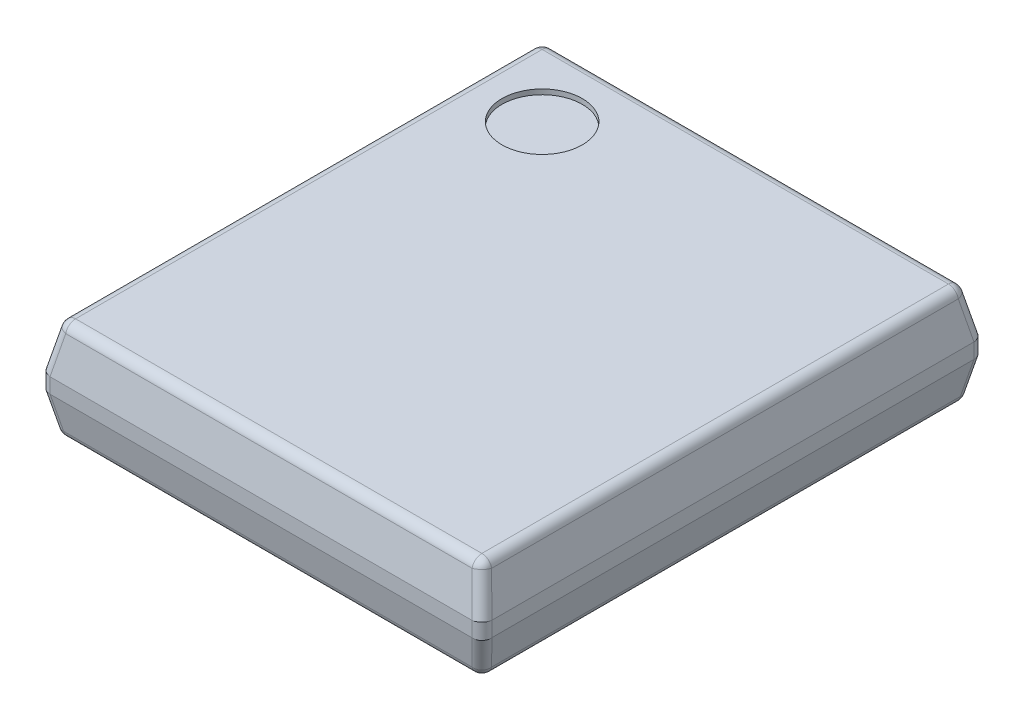
ISO-10303-21;
HEADER;
FILE_DESCRIPTION(('STEP AP214'),'2;1');
FILE_NAME('part.step','',(''),(''),'','','');
FILE_SCHEMA(('AUTOMOTIVE_DESIGN { 1 0 10303 214 1 1 1 1 }'));
ENDSEC;
DATA;
#1=APPLICATION_CONTEXT('core data for automotive mechanical design processes');
#2=APPLICATION_PROTOCOL_DEFINITION('international standard','automotive_design',2000,#1);
#3=PRODUCT_CONTEXT('',#1,'mechanical');
#4=PRODUCT('Part','Part','',(#3));
#5=PRODUCT_RELATED_PRODUCT_CATEGORY('part','',(#4));
#6=PRODUCT_DEFINITION_FORMATION('','',#4);
#7=PRODUCT_DEFINITION_CONTEXT('part definition',#1,'design');
#8=PRODUCT_DEFINITION('design','',#6,#7);
#9=PRODUCT_DEFINITION_SHAPE('','',#8);
#10=(LENGTH_UNIT() NAMED_UNIT(*) SI_UNIT(.MILLI.,.METRE.));
#11=(NAMED_UNIT(*) PLANE_ANGLE_UNIT() SI_UNIT($,.RADIAN.));
#12=(NAMED_UNIT(*) SI_UNIT($,.STERADIAN.) SOLID_ANGLE_UNIT());
#13=UNCERTAINTY_MEASURE_WITH_UNIT(LENGTH_MEASURE(1.E-05),#10,'distance_accuracy_value','');
#14=(GEOMETRIC_REPRESENTATION_CONTEXT(3) GLOBAL_UNCERTAINTY_ASSIGNED_CONTEXT((#13)) GLOBAL_UNIT_ASSIGNED_CONTEXT((#10,
#11,#12)) REPRESENTATION_CONTEXT('',''));
#15=CARTESIAN_POINT('',(0.,0.,0.));
#16=DIRECTION('',(0.,0.,1.));
#17=DIRECTION('',(1.,0.,0.));
#18=AXIS2_PLACEMENT_3D('',#15,#16,#17);
#19=CARTESIAN_POINT('',(8.213637663993,1.93,-0.471641184493));
#20=DIRECTION('',(0.,0.629320391049922,-0.777145961456903));
#21=DIRECTION('',(0.,-0.777145961456903,-0.629320391049922));
#22=AXIS2_PLACEMENT_3D('',#19,#20,#21);
#23=SPHERICAL_SURFACE('',#22,0.1);
#24=CARTESIAN_POINT('',(8.213637663993,1.93,-0.471641184493));
#25=DIRECTION('',(-1.,0.,0.));
#26=DIRECTION('',(0.,-0.20791169081795,-0.978147600733765));
#27=AXIS2_PLACEMENT_3D('',#24,#25,#26);
#28=CIRCLE('',#27,0.1);
#29=CARTESIAN_POINT('',(8.213637663993,1.909208830918,-0.569455944567));
#30=VERTEX_POINT('',#29);
#31=CARTESIAN_POINT('',(8.213637663993,1.83,-0.471641184493));
#32=VERTEX_POINT('',#31);
#33=EDGE_CURVE('E11',#30,#32,#28,.T.);
#34=ORIENTED_EDGE('',*,*,#33,.T.);
#35=CARTESIAN_POINT('',(8.213637663993,1.93,-0.471641184493));
#36=DIRECTION('',(0.,0.,-1.));
#37=DIRECTION('',(0.,-1.,0.));
#38=AXIS2_PLACEMENT_3D('',#35,#36,#37);
#39=CIRCLE('',#38,0.1);
#40=CARTESIAN_POINT('',(8.115822903919,1.909208830918,-0.471641184493));
#41=VERTEX_POINT('',#40);
#42=EDGE_CURVE('E492',#32,#41,#39,.T.);
#43=ORIENTED_EDGE('',*,*,#42,.T.);
#44=CARTESIAN_POINT('',(8.213637663993,1.93,-0.471641184493));
#45=DIRECTION('',(0.203558594952956,-0.957667894857893,0.203558594952977));
#46=DIRECTION('',(-0.978147600733765,-0.20791169081795,0.));
#47=AXIS2_PLACEMENT_3D('',#44,#45,#46);
#48=CIRCLE('',#47,0.1);
#49=EDGE_CURVE('E288',#41,#30,#48,.T.);
#50=ORIENTED_EDGE('',*,*,#49,.T.);
#51=EDGE_LOOP('',(#34,#43,#50));
#52=FACE_BOUND('',#51,.T.);
#53=ADVANCED_FACE('F17',(#52),#23,.T.);
#54=CARTESIAN_POINT('',(2.311796636005,1.93,-0.471641184493));
#55=DIRECTION('',(1.,0.,0.));
#56=DIRECTION('',(0.,-1.,0.));
#57=AXIS2_PLACEMENT_3D('',#54,#55,#56);
#58=CYLINDRICAL_SURFACE('',#57,0.1);
#59=DIRECTION('',(1.,0.,0.));
#60=VECTOR('',#59,1.);
#61=CARTESIAN_POINT('',(8.213637663993,1.909208830918,-0.569455944567));
#62=LINE('',#61,#60);
#63=CARTESIAN_POINT('',(12.281635608017,1.909208830918,-0.569455944567));
#64=VERTEX_POINT('',#63);
#65=EDGE_CURVE('E433',#30,#64,#62,.T.);
#66=ORIENTED_EDGE('',*,*,#65,.T.);
#67=CARTESIAN_POINT('',(12.281635608017,1.93,-0.471641184493));
#68=DIRECTION('',(1.,0.,0.));
#69=DIRECTION('',(0.,-1.,0.));
#70=AXIS2_PLACEMENT_3D('',#67,#68,#69);
#71=CIRCLE('',#70,0.1);
#72=CARTESIAN_POINT('',(12.281635608017,1.83,-0.471641184493));
#73=VERTEX_POINT('',#72);
#74=EDGE_CURVE('E27',#73,#64,#71,.T.);
#75=ORIENTED_EDGE('',*,*,#74,.F.);
#76=DIRECTION('',(1.,0.,0.));
#77=VECTOR('',#76,1.);
#78=CARTESIAN_POINT('',(8.213637663993,1.83,-0.471641184493));
#79=LINE('',#78,#77);
#80=EDGE_CURVE('E621',#32,#73,#79,.T.);
#81=ORIENTED_EDGE('',*,*,#80,.F.);
#82=ORIENTED_EDGE('',*,*,#33,.F.);
#83=EDGE_LOOP('',(#66,#75,#81,#82));
#84=FACE_BOUND('',#83,.T.);
#85=ADVANCED_FACE('F602',(#84),#58,.T.);
#86=CARTESIAN_POINT('',(12.281635608017,1.93,-0.471641184493));
#87=DIRECTION('',(-0.707106781186548,0.,-0.707106781186548));
#88=DIRECTION('',(0.677173462578709,-0.287875325719876,-0.677173462578709));
#89=AXIS2_PLACEMENT_3D('',#86,#87,#88);
#90=SPHERICAL_SURFACE('',#89,0.1);
#91=CARTESIAN_POINT('',(12.281635608017,1.93,-0.471641184493));
#92=DIRECTION('',(0.,0.,-1.));
#93=DIRECTION('',(0.978147600733765,-0.20791169081795,0.));
#94=AXIS2_PLACEMENT_3D('',#91,#92,#93);
#95=CIRCLE('',#94,0.1);
#96=CARTESIAN_POINT('',(12.379450368091,1.909208830918,-0.471641184493));
#97=VERTEX_POINT('',#96);
#98=EDGE_CURVE('E530',#97,#73,#95,.T.);
#99=ORIENTED_EDGE('',*,*,#98,.T.);
#100=ORIENTED_EDGE('',*,*,#74,.T.);
#101=CARTESIAN_POINT('',(12.281635608017,1.93,-0.471641184493));
#102=DIRECTION('',(-0.203558594952977,-0.957667894857893,0.203558594952956));
#103=DIRECTION('',(0.,-0.20791169081795,-0.978147600733765));
#104=AXIS2_PLACEMENT_3D('',#101,#102,#103);
#105=CIRCLE('',#104,0.1);
#106=EDGE_CURVE('E446',#64,#97,#105,.T.);
#107=ORIENTED_EDGE('',*,*,#106,.T.);
#108=EDGE_LOOP('',(#99,#100,#107));
#109=FACE_BOUND('',#108,.T.);
#110=ADVANCED_FACE('F608',(#109),#90,.T.);
#111=CARTESIAN_POINT('',(8.047636636005,2.23,4.362357787519));
#112=DIRECTION('',(0.,-0.20791169081795,0.978147600733765));
#113=DIRECTION('',(-1.,0.,0.));
#114=AXIS2_PLACEMENT_3D('',#111,#112,#113);
#115=PLANE('',#114);
#116=DIRECTION('',(-0.203558594952977,-0.957667894857889,-0.203558594952977));
#117=VECTOR('',#116,1.);
#118=CARTESIAN_POINT('',(12.349798504817,2.229890047549,4.362334416404));
#119=LINE('',#118,#117);
#120=CARTESIAN_POINT('',(12.3487007762339,2.22986601338305,4.36232930778436));
#121=VERTEX_POINT('',#120);
#122=CARTESIAN_POINT('',(12.281635608017,1.909208830918,4.294171519605));
#123=VERTEX_POINT('',#122);
#124=EDGE_CURVE('E251',#121,#123,#119,.T.);
#125=ORIENTED_EDGE('',*,*,#124,.F.);
#126=DIRECTION('',(1.,0.,0.));
#127=VECTOR('',#126,1.);
#128=CARTESIAN_POINT('',(8.147636636005,2.23,4.362357787519));
#129=LINE('',#128,#127);
#130=CARTESIAN_POINT('',(8.14658362211617,2.22981366806874,4.36231818144432));
#131=VERTEX_POINT('',#130);
#132=EDGE_CURVE('E264',#131,#121,#129,.T.);
#133=ORIENTED_EDGE('',*,*,#132,.F.);
#134=DIRECTION('',(0.203558594952977,-0.957667894857889,-0.203558594952977));
#135=VECTOR('',#134,1.);
#136=CARTESIAN_POINT('',(8.145474767193,2.229890047549,4.362334416404));
#137=LINE('',#136,#135);
#138=CARTESIAN_POINT('',(8.213637663993,1.909208830918,4.294171519605));
#139=VERTEX_POINT('',#138);
#140=EDGE_CURVE('E474',#131,#139,#137,.T.);
#141=ORIENTED_EDGE('',*,*,#140,.T.);
#142=DIRECTION('',(-1.,0.,0.));
#143=VECTOR('',#142,1.);
#144=CARTESIAN_POINT('',(12.281635608017,1.909208830918,4.294171519605));
#145=LINE('',#144,#143);
#146=EDGE_CURVE('E525',#123,#139,#145,.T.);
#147=ORIENTED_EDGE('',*,*,#146,.F.);
#148=EDGE_LOOP('',(#125,#133,#141,#147));
#149=FACE_BOUND('',#148,.T.);
#150=ADVANCED_FACE('F1058',(#149),#115,.T.);
#151=CARTESIAN_POINT('',(12.750025247314,4.1336,4.664746398828));
#152=DIRECTION('',(-0.203558594952956,-0.957667894857893,-0.203558594952977));
#153=DIRECTION('',(0.978147600733765,-0.20791169081795,0.));
#154=AXIS2_PLACEMENT_3D('',#151,#152,#153);
#155=CYLINDRICAL_SURFACE('',#154,0.1);
#156=ORIENTED_EDGE('',*,*,#124,.T.);
#157=CARTESIAN_POINT('',(12.281635608017,1.93,4.196356759531));
#158=DIRECTION('',(-0.203558594952956,-0.957667894857893,-0.203558594952977));
#159=DIRECTION('',(0.978147600733765,-0.20791169081795,0.));
#160=AXIS2_PLACEMENT_3D('',#157,#158,#159);
#161=CIRCLE('',#160,0.1);
#162=CARTESIAN_POINT('',(12.379450368091,1.909208830918,4.196356759531));
#163=VERTEX_POINT('',#162);
#164=EDGE_CURVE('E521',#163,#123,#161,.T.);
#165=ORIENTED_EDGE('',*,*,#164,.F.);
#166=DIRECTION('',(-0.203558594952977,-0.957667894857889,-0.203558594952977));
#167=VECTOR('',#166,1.);
#168=CARTESIAN_POINT('',(12.44761326489,2.229890047549,4.264519656331));
#169=LINE('',#168,#167);
#170=CARTESIAN_POINT('',(12.4476011592059,2.22983309478305,4.26341493068342));
#171=VERTEX_POINT('',#170);
#172=EDGE_CURVE('E457',#171,#163,#169,.T.);
#173=ORIENTED_EDGE('',*,*,#172,.F.);
#174=CARTESIAN_POINT('',(12.34763206419,2.240511374283,4.262353215704));
#175=DIRECTION('',(-0.10287383673995,-0.989360372881795,-0.10287383673995));
#176=DIRECTION('',(-0.699583428701968,0.145485575130993,-0.699583428701968));
#177=AXIS2_PLACEMENT_3D('',#174,#175,#176);
#178=ELLIPSE('',#177,0.101081939669,0.10000271133);
#179=EDGE_CURVE('E256',#171,#121,#178,.T.);
#180=ORIENTED_EDGE('',*,*,#179,.T.);
#181=EDGE_LOOP('',(#156,#165,#173,#180));
#182=FACE_BOUND('',#181,.T.);
#183=ADVANCED_FACE('F1206',(#182),#155,.T.);
#184=CARTESIAN_POINT('',(11.972663389974,4.1336,3.887384541488));
#185=DIRECTION('',(0.203558594952956,-0.957667894857893,0.203558594952977));
#186=DIRECTION('',(0.978147600733765,0.20791169081795,0.));
#187=AXIS2_PLACEMENT_3D('',#184,#185,#186);
#188=CYLINDRICAL_SURFACE('',#187,0.1);
#189=DIRECTION('',(0.203558594952977,-0.957667894857889,0.203558594952977));
#190=VECTOR('',#189,1.);
#191=CARTESIAN_POINT('',(12.368822540007,2.750791169082,4.185728931448));
#192=LINE('',#191,#190);
#193=CARTESIAN_POINT('',(12.368822540007,2.750791169082,4.185728931448));
#194=VERTEX_POINT('',#193);
#195=CARTESIAN_POINT('',(12.4476081562703,2.38013398661692,4.26342192774778));
#196=VERTEX_POINT('',#195);
#197=EDGE_CURVE('E385',#194,#196,#192,.T.);
#198=ORIENTED_EDGE('',*,*,#197,.F.);
#199=CARTESIAN_POINT('',(12.271007779934,2.73,4.185728931448));
#200=DIRECTION('',(-0.203558594952977,0.957667894857893,-0.203558594952956));
#201=DIRECTION('',(0.,0.20791169081795,0.978147600733765));
#202=AXIS2_PLACEMENT_3D('',#199,#200,#201);
#203=CIRCLE('',#202,0.1);
#204=CARTESIAN_POINT('',(12.271007779934,2.750791169082,4.283543691521));
#205=VERTEX_POINT('',#204);
#206=EDGE_CURVE('E505',#205,#194,#203,.T.);
#207=ORIENTED_EDGE('',*,*,#206,.F.);
#208=DIRECTION('',(0.203558594952977,-0.957667894857889,0.203558594952977));
#209=VECTOR('',#208,1.);
#210=CARTESIAN_POINT('',(12.271007779934,2.750791169082,4.283543691521));
#211=LINE('',#210,#209);
#212=CARTESIAN_POINT('',(12.3487007762338,2.38013398661692,4.36232930778428));
#213=VERTEX_POINT('',#212);
#214=EDGE_CURVE('E361',#205,#213,#211,.T.);
#215=ORIENTED_EDGE('',*,*,#214,.T.);
#216=CARTESIAN_POINT('',(12.34763206419,2.369488625717,4.262353215704));
#217=DIRECTION('',(-0.10287383673995,0.989360372881795,-0.10287383673995));
#218=DIRECTION('',(0.699583428702968,0.145485575130993,0.699583428700969));
#219=AXIS2_PLACEMENT_3D('',#216,#217,#218);
#220=ELLIPSE('',#219,0.101081939669,0.10000271133);
#221=EDGE_CURVE('E261',#213,#196,#220,.T.);
#222=ORIENTED_EDGE('',*,*,#221,.T.);
#223=EDGE_LOOP('',(#198,#207,#215,#222));
#224=FACE_BOUND('',#223,.T.);
#225=ADVANCED_FACE('F1198',(#224),#188,.T.);
#226=CARTESIAN_POINT('',(8.224265492076,2.73,4.185728931448));
#227=DIRECTION('',(0.,-0.629320391049922,0.777145961456903));
#228=DIRECTION('',(0.,0.777145961456903,0.629320391049922));
#229=AXIS2_PLACEMENT_3D('',#226,#227,#228);
#230=SPHERICAL_SURFACE('',#229,0.1);
#231=CARTESIAN_POINT('',(8.224265492076,2.73,4.185728931448));
#232=DIRECTION('',(0.203558594952956,0.957667894857893,-0.203558594952977));
#233=DIRECTION('',(-0.978147600733765,0.20791169081795,0.));
#234=AXIS2_PLACEMENT_3D('',#231,#232,#233);
#235=CIRCLE('',#234,0.1);
#236=CARTESIAN_POINT('',(8.126450732003,2.750791169082,4.185728931448));
#237=VERTEX_POINT('',#236);
#238=CARTESIAN_POINT('',(8.224265492076,2.750791169082,4.283543691521));
#239=VERTEX_POINT('',#238);
#240=EDGE_CURVE('E343',#237,#239,#235,.T.);
#241=ORIENTED_EDGE('',*,*,#240,.T.);
#242=CARTESIAN_POINT('',(8.224265492076,2.73,4.185728931448));
#243=DIRECTION('',(-1.,0.,0.));
#244=DIRECTION('',(0.,0.20791169081795,0.978147600733765));
#245=AXIS2_PLACEMENT_3D('',#242,#243,#244);
#246=CIRCLE('',#245,0.1);
#247=CARTESIAN_POINT('',(8.224265492076,2.83,4.185728931448));
#248=VERTEX_POINT('',#247);
#249=EDGE_CURVE('E377',#239,#248,#246,.T.);
#250=ORIENTED_EDGE('',*,*,#249,.T.);
#251=CARTESIAN_POINT('',(8.224265492076,2.73,4.185728931448));
#252=DIRECTION('',(0.,0.,1.));
#253=DIRECTION('',(0.,1.,0.));
#254=AXIS2_PLACEMENT_3D('',#251,#252,#253);
#255=CIRCLE('',#254,0.1);
#256=EDGE_CURVE('E234',#248,#237,#255,.T.);
#257=ORIENTED_EDGE('',*,*,#256,.T.);
#258=EDGE_LOOP('',(#241,#250,#257));
#259=FACE_BOUND('',#258,.T.);
#260=ADVANCED_FACE('F1039',(#259),#230,.T.);
#261=CARTESIAN_POINT('',(12.271007779934,2.73,-0.46101335641));
#262=DIRECTION('',(0.,-0.629320391049922,-0.777145961456903));
#263=DIRECTION('',(0.,0.777145961456903,-0.629320391049922));
#264=AXIS2_PLACEMENT_3D('',#261,#262,#263);
#265=SPHERICAL_SURFACE('',#264,0.1);
#266=CARTESIAN_POINT('',(12.271007779934,2.73,-0.46101335641));
#267=DIRECTION('',(1.,0.,0.));
#268=DIRECTION('',(0.,0.20791169081795,-0.978147600733765));
#269=AXIS2_PLACEMENT_3D('',#266,#267,#268);
#270=CIRCLE('',#269,0.1);
#271=CARTESIAN_POINT('',(12.271007779934,2.750791169082,-0.558828116483));
#272=VERTEX_POINT('',#271);
#273=CARTESIAN_POINT('',(12.271007779934,2.83,-0.46101335641));
#274=VERTEX_POINT('',#273);
#275=EDGE_CURVE('E209',#272,#274,#270,.T.);
#276=ORIENTED_EDGE('',*,*,#275,.T.);
#277=CARTESIAN_POINT('',(12.271007779934,2.73,-0.46101335641));
#278=DIRECTION('',(0.,0.,-1.));
#279=DIRECTION('',(0.,1.,0.));
#280=AXIS2_PLACEMENT_3D('',#277,#278,#279);
#281=CIRCLE('',#280,0.1);
#282=CARTESIAN_POINT('',(12.368822540007,2.750791169082,-0.46101335641));
#283=VERTEX_POINT('',#282);
#284=EDGE_CURVE('E388',#274,#283,#281,.T.);
#285=ORIENTED_EDGE('',*,*,#284,.T.);
#286=CARTESIAN_POINT('',(12.271007779934,2.73,-0.46101335641));
#287=DIRECTION('',(-0.203558594952956,0.957667894857893,0.203558594952977));
#288=DIRECTION('',(0.978147600733765,0.20791169081795,0.));
#289=AXIS2_PLACEMENT_3D('',#286,#287,#288);
#290=CIRCLE('',#289,0.1);
#291=EDGE_CURVE('E407',#283,#272,#290,.T.);
#292=ORIENTED_EDGE('',*,*,#291,.T.);
#293=EDGE_LOOP('',(#276,#285,#292));
#294=FACE_BOUND('',#293,.T.);
#295=ADVANCED_FACE('F596',(#294),#265,.T.);
#296=CARTESIAN_POINT('',(8.847636636005,2.78,0.162357787519));
#297=DIRECTION('',(0.,-1.,0.));
#298=DIRECTION('',(0.,0.,-1.));
#299=AXIS2_PLACEMENT_3D('',#296,#297,#298);
#300=PLANE('',#299);
#301=CARTESIAN_POINT('',(8.847636636005,2.78,0.162357787519));
#302=DIRECTION('',(0.,-1.,0.));
#303=DIRECTION('',(1.,0.,0.));
#304=AXIS2_PLACEMENT_3D('',#301,#302,#303);
#305=CIRCLE('',#304,0.4);
#306=CARTESIAN_POINT('',(9.247636636005,2.78,0.162357787519));
#307=VERTEX_POINT('',#306);
#308=EDGE_CURVE('E38',#307,#307,#305,.T.);
#309=ORIENTED_EDGE('',*,*,#308,.F.);
#310=EDGE_LOOP('',(#309));
#311=FACE_BOUND('',#310,.T.);
#312=ADVANCED_FACE('F587',(#311),#300,.F.);
#313=CARTESIAN_POINT('',(8.847636636005,2.83,0.162357787519));
#314=DIRECTION('',(0.,-1.,0.));
#315=DIRECTION('',(1.,0.,0.));
#316=AXIS2_PLACEMENT_3D('',#313,#314,#315);
#317=CYLINDRICAL_SURFACE('',#316,0.4);
#318=CARTESIAN_POINT('',(8.847636636005,2.83,0.162357787519));
#319=DIRECTION('',(0.,-1.,0.));
#320=DIRECTION('',(1.,0.,0.));
#321=AXIS2_PLACEMENT_3D('',#318,#319,#320);
#322=CIRCLE('',#321,0.4);
#323=CARTESIAN_POINT('',(9.247636636005,2.83,0.162357787519));
#324=VERTEX_POINT('',#323);
#325=EDGE_CURVE('E248',#324,#324,#322,.T.);
#326=ORIENTED_EDGE('',*,*,#325,.F.);
#327=EDGE_LOOP('',(#326));
#328=FACE_BOUND('',#327,.T.);
#329=ORIENTED_EDGE('',*,*,#308,.T.);
#330=EDGE_LOOP('',(#329));
#331=FACE_BOUND('',#330,.T.);
#332=ADVANCED_FACE('F585',(#328,#331),#317,.F.);
#333=CARTESIAN_POINT('',(10.247636636005,2.83,1.862357787519));
#334=DIRECTION('',(0.,1.,0.));
#335=DIRECTION('',(1.,0.,0.));
#336=AXIS2_PLACEMENT_3D('',#333,#334,#335);
#337=PLANE('',#336);
#338=ORIENTED_EDGE('',*,*,#325,.T.);
#339=EDGE_LOOP('',(#338));
#340=FACE_BOUND('',#339,.T.);
#341=DIRECTION('',(0.,0.,1.));
#342=VECTOR('',#341,1.);
#343=CARTESIAN_POINT('',(8.224265492076,2.83,-0.46101335641));
#344=LINE('',#343,#342);
#345=CARTESIAN_POINT('',(8.224265492076,2.83,-0.46101335641));
#346=VERTEX_POINT('',#345);
#347=EDGE_CURVE('E202',#346,#248,#344,.T.);
#348=ORIENTED_EDGE('',*,*,#347,.T.);
#349=DIRECTION('',(1.,0.,0.));
#350=VECTOR('',#349,1.);
#351=CARTESIAN_POINT('',(8.224265492076,2.83,4.185728931448));
#352=LINE('',#351,#350);
#353=CARTESIAN_POINT('',(12.271007779934,2.83,4.185728931448));
#354=VERTEX_POINT('',#353);
#355=EDGE_CURVE('E520',#248,#354,#352,.T.);
#356=ORIENTED_EDGE('',*,*,#355,.T.);
#357=DIRECTION('',(0.,0.,-1.));
#358=VECTOR('',#357,1.);
#359=CARTESIAN_POINT('',(12.271007779934,2.83,4.185728931448));
#360=LINE('',#359,#358);
#361=EDGE_CURVE('E205',#354,#274,#360,.T.);
#362=ORIENTED_EDGE('',*,*,#361,.T.);
#363=DIRECTION('',(-1.,0.,0.));
#364=VECTOR('',#363,1.);
#365=CARTESIAN_POINT('',(12.271007779934,2.83,-0.46101335641));
#366=LINE('',#365,#364);
#367=EDGE_CURVE('E198',#274,#346,#366,.T.);
#368=ORIENTED_EDGE('',*,*,#367,.T.);
#369=EDGE_LOOP('',(#348,#356,#362,#368));
#370=FACE_BOUND('',#369,.T.);
#371=ADVANCED_FACE('F200',(#340,#370),#337,.T.);
#372=CARTESIAN_POINT('',(18.183476636005,2.73,-0.46101335641));
#373=DIRECTION('',(-1.,0.,0.));
#374=DIRECTION('',(0.,1.,0.));
#375=AXIS2_PLACEMENT_3D('',#372,#373,#374);
#376=CYLINDRICAL_SURFACE('',#375,0.1);
#377=ORIENTED_EDGE('',*,*,#367,.F.);
#378=ORIENTED_EDGE('',*,*,#275,.F.);
#379=DIRECTION('',(-1.,0.,0.));
#380=VECTOR('',#379,1.);
#381=CARTESIAN_POINT('',(12.271007779934,2.750791169082,-0.558828116483));
#382=LINE('',#381,#380);
#383=CARTESIAN_POINT('',(8.224265492076,2.750791169082,-0.558828116483));
#384=VERTEX_POINT('',#383);
#385=EDGE_CURVE('E217',#272,#384,#382,.T.);
#386=ORIENTED_EDGE('',*,*,#385,.T.);
#387=CARTESIAN_POINT('',(8.224265492076,2.73,-0.46101335641));
#388=DIRECTION('',(-1.,0.,0.));
#389=DIRECTION('',(0.,1.,0.));
#390=AXIS2_PLACEMENT_3D('',#387,#388,#389);
#391=CIRCLE('',#390,0.1);
#392=EDGE_CURVE('E213',#346,#384,#391,.T.);
#393=ORIENTED_EDGE('',*,*,#392,.F.);
#394=EDGE_LOOP('',(#377,#378,#386,#393));
#395=FACE_BOUND('',#394,.T.);
#396=ADVANCED_FACE('F215',(#395),#376,.T.);
#397=CARTESIAN_POINT('',(8.047636636005,1.83,-0.637642212481));
#398=DIRECTION('',(-1.,0.,0.));
#399=DIRECTION('',(0.,0.,1.));
#400=AXIS2_PLACEMENT_3D('',#397,#398,#399);
#401=PLANE('',#400);
#402=DIRECTION('',(0.,-1.,0.));
#403=VECTOR('',#402,1.);
#404=CARTESIAN_POINT('',(8.047636636005,2.38,-0.537642212481));
#405=LINE('',#404,#403);
#406=CARTESIAN_POINT('',(8.04767624207972,2.38018633193107,-0.538695226369782));
#407=VERTEX_POINT('',#406);
#408=CARTESIAN_POINT('',(8.04767624207967,2.22981366806875,-0.538695226369828));
#409=VERTEX_POINT('',#408);
#410=EDGE_CURVE('E210',#407,#409,#405,.T.);
#411=ORIENTED_EDGE('',*,*,#410,.T.);
#412=DIRECTION('',(0.,0.,1.));
#413=VECTOR('',#412,1.);
#414=CARTESIAN_POINT('',(8.047636636005,2.23,-0.537642212481));
#415=LINE('',#414,#413);
#416=CARTESIAN_POINT('',(8.04767624207967,2.22981366806876,4.26341080140783));
#417=VERTEX_POINT('',#416);
#418=EDGE_CURVE('E296',#409,#417,#415,.T.);
#419=ORIENTED_EDGE('',*,*,#418,.T.);
#420=DIRECTION('',(0.,-1.,0.));
#421=VECTOR('',#420,1.);
#422=CARTESIAN_POINT('',(8.047636636005,2.38,4.262357787519));
#423=LINE('',#422,#421);
#424=CARTESIAN_POINT('',(8.04767624207972,2.38018633193106,4.26341080140779));
#425=VERTEX_POINT('',#424);
#426=EDGE_CURVE('E276',#425,#417,#423,.T.);
#427=ORIENTED_EDGE('',*,*,#426,.F.);
#428=DIRECTION('',(0.,0.,1.));
#429=VECTOR('',#428,1.);
#430=CARTESIAN_POINT('',(8.047636636005,2.38,-0.537642212481));
#431=LINE('',#430,#429);
#432=EDGE_CURVE('E242',#407,#425,#431,.T.);
#433=ORIENTED_EDGE('',*,*,#432,.F.);
#434=EDGE_LOOP('',(#411,#419,#427,#433));
#435=FACE_BOUND('',#434,.T.);
#436=ADVANCED_FACE('F1174',(#435),#401,.T.);
#437=CARTESIAN_POINT('',(8.147636636005,4.1336,-0.537642212481));
#438=DIRECTION('',(0.,-1.,0.));
#439=DIRECTION('',(-1.,0.,0.));
#440=AXIS2_PLACEMENT_3D('',#437,#438,#439);
#441=CYLINDRICAL_SURFACE('',#440,0.1);
#442=ORIENTED_EDGE('',*,*,#410,.F.);
#443=CARTESIAN_POINT('',(8.147641207819,2.369488625717,-0.537637640667));
#444=DIRECTION('',(0.102873836740714,0.989360372881636,0.102873836740714));
#445=DIRECTION('',(0.699583428703356,-0.145485575132074,0.699583428700356));
#446=AXIS2_PLACEMENT_3D('',#443,#444,#445);
#447=ELLIPSE('',#446,0.101081939668,0.10000271133);
#448=CARTESIAN_POINT('',(8.14658362179838,2.38018633043575,-0.637602606724123));
#449=VERTEX_POINT('',#448);
#450=EDGE_CURVE('E222',#449,#407,#447,.T.);
#451=ORIENTED_EDGE('',*,*,#450,.F.);
#452=DIRECTION('',(0.,-1.,0.));
#453=VECTOR('',#452,1.);
#454=CARTESIAN_POINT('',(8.147636636005,2.38,-0.637642212481));
#455=LINE('',#454,#453);
#456=CARTESIAN_POINT('',(8.14657249609167,2.22986601189861,-0.63761373243083));
#457=VERTEX_POINT('',#456);
#458=EDGE_CURVE('E331',#449,#457,#455,.T.);
#459=ORIENTED_EDGE('',*,*,#458,.T.);
#460=CARTESIAN_POINT('',(8.147641207818,2.240511374282,-0.537637640668));
#461=DIRECTION('',(0.102873836741407,-0.989360372881492,0.102873836741407));
#462=DIRECTION('',(-0.699583428702254,-0.145485575133053,-0.699583428701254));
#463=AXIS2_PLACEMENT_3D('',#460,#461,#462);
#464=ELLIPSE('',#463,0.101081939668,0.100002711329);
#465=EDGE_CURVE('E283',#409,#457,#464,.T.);
#466=ORIENTED_EDGE('',*,*,#465,.F.);
#467=EDGE_LOOP('',(#442,#451,#459,#466));
#468=FACE_BOUND('',#467,.T.);
#469=ADVANCED_FACE('F1165',(#468),#441,.T.);
#470=CARTESIAN_POINT('',(8.522609882036,4.1336,-0.16266896645));
#471=DIRECTION('',(-0.203558594952956,-0.957667894857893,-0.203558594952977));
#472=DIRECTION('',(-0.978147600733765,0.20791169081795,0.));
#473=AXIS2_PLACEMENT_3D('',#470,#471,#472);
#474=CYLINDRICAL_SURFACE('',#473,0.1);
#475=DIRECTION('',(-0.203558594952977,-0.957667894857889,-0.203558594952977));
#476=VECTOR('',#475,1.);
#477=CARTESIAN_POINT('',(8.126450732003,2.750791169082,-0.46101335641));
#478=LINE('',#477,#476);
#479=CARTESIAN_POINT('',(8.126450732003,2.750791169082,-0.46101335641));
#480=VERTEX_POINT('',#479);
#481=EDGE_CURVE('E312',#480,#407,#478,.T.);
#482=ORIENTED_EDGE('',*,*,#481,.F.);
#483=CARTESIAN_POINT('',(8.224265492076,2.73,-0.46101335641));
#484=DIRECTION('',(0.203558594952977,0.957667894857893,0.203558594952956));
#485=DIRECTION('',(0.,0.20791169081795,-0.978147600733765));
#486=AXIS2_PLACEMENT_3D('',#483,#484,#485);
#487=CIRCLE('',#486,0.1);
#488=EDGE_CURVE('E223',#384,#480,#487,.T.);
#489=ORIENTED_EDGE('',*,*,#488,.F.);
#490=DIRECTION('',(-0.203558594952977,-0.957667894857889,-0.203558594952977));
#491=VECTOR('',#490,1.);
#492=CARTESIAN_POINT('',(8.224265492076,2.750791169082,-0.558828116483));
#493=LINE('',#492,#491);
#494=EDGE_CURVE('E321',#384,#449,#493,.T.);
#495=ORIENTED_EDGE('',*,*,#494,.T.);
#496=ORIENTED_EDGE('',*,*,#450,.T.);
#497=EDGE_LOOP('',(#482,#489,#495,#496));
#498=FACE_BOUND('',#497,.T.);
#499=ADVANCED_FACE('F1157',(#498),#474,.T.);
#500=CARTESIAN_POINT('',(8.224265492076,2.73,-0.46101335641));
#501=DIRECTION('',(0.707106781186548,0.,-0.707106781186548));
#502=DIRECTION('',(-0.677173462578709,0.287875325719876,-0.677173462578709));
#503=AXIS2_PLACEMENT_3D('',#500,#501,#502);
#504=SPHERICAL_SURFACE('',#503,0.1);
#505=ORIENTED_EDGE('',*,*,#488,.T.);
#506=CARTESIAN_POINT('',(8.224265492076,2.73,-0.46101335641));
#507=DIRECTION('',(0.,0.,-1.));
#508=DIRECTION('',(-0.978147600733765,0.20791169081795,0.));
#509=AXIS2_PLACEMENT_3D('',#506,#507,#508);
#510=CIRCLE('',#509,0.1);
#511=EDGE_CURVE('E226',#480,#346,#510,.T.);
#512=ORIENTED_EDGE('',*,*,#511,.T.);
#513=ORIENTED_EDGE('',*,*,#392,.T.);
#514=EDGE_LOOP('',(#505,#512,#513));
#515=FACE_BOUND('',#514,.T.);
#516=ADVANCED_FACE('F227',(#515),#504,.T.);
#517=CARTESIAN_POINT('',(8.224265492076,2.73,-7.155642212481));
#518=DIRECTION('',(0.,0.,1.));
#519=DIRECTION('',(0.,1.,0.));
#520=AXIS2_PLACEMENT_3D('',#517,#518,#519);
#521=CYLINDRICAL_SURFACE('',#520,0.1);
#522=DIRECTION('',(0.,0.,1.));
#523=VECTOR('',#522,1.);
#524=CARTESIAN_POINT('',(8.126450732003,2.750791169082,-0.46101335641));
#525=LINE('',#524,#523);
#526=EDGE_CURVE('E318',#480,#237,#525,.T.);
#527=ORIENTED_EDGE('',*,*,#526,.T.);
#528=ORIENTED_EDGE('',*,*,#256,.F.);
#529=ORIENTED_EDGE('',*,*,#347,.F.);
#530=ORIENTED_EDGE('',*,*,#511,.F.);
#531=EDGE_LOOP('',(#527,#528,#529,#530));
#532=FACE_BOUND('',#531,.T.);
#533=ADVANCED_FACE('F233',(#532),#521,.T.);
#534=CARTESIAN_POINT('',(8.047636636005,2.38,-0.637642212481));
#535=DIRECTION('',(-0.978147600733765,0.20791169081795,0.));
#536=DIRECTION('',(0.,0.,1.));
#537=AXIS2_PLACEMENT_3D('',#534,#535,#536);
#538=PLANE('',#537);
#539=ORIENTED_EDGE('',*,*,#526,.F.);
#540=ORIENTED_EDGE('',*,*,#481,.T.);
#541=ORIENTED_EDGE('',*,*,#432,.T.);
#542=DIRECTION('',(-0.203558594952977,-0.957667894857889,0.203558594952977));
#543=VECTOR('',#542,1.);
#544=CARTESIAN_POINT('',(8.126450732003,2.750791169082,4.185728931448));
#545=LINE('',#544,#543);
#546=EDGE_CURVE('E339',#237,#425,#545,.T.);
#547=ORIENTED_EDGE('',*,*,#546,.F.);
#548=EDGE_LOOP('',(#539,#540,#541,#547));
#549=FACE_BOUND('',#548,.T.);
#550=ADVANCED_FACE('F1133',(#549),#538,.T.);
#551=CARTESIAN_POINT('',(8.522609882036,4.1336,3.887384541488));
#552=DIRECTION('',(-0.203558594952977,-0.957667894857893,0.203558594952956));
#553=DIRECTION('',(0.,0.20791169081795,0.978147600733765));
#554=AXIS2_PLACEMENT_3D('',#551,#552,#553);
#555=CYLINDRICAL_SURFACE('',#554,0.1);
#556=DIRECTION('',(-0.203558594952977,-0.957667894857889,0.203558594952977));
#557=VECTOR('',#556,1.);
#558=CARTESIAN_POINT('',(8.224265492076,2.750791169082,4.283543691521));
#559=LINE('',#558,#557);
#560=CARTESIAN_POINT('',(8.14657249577622,2.3801339866169,4.36232930778428));
#561=VERTEX_POINT('',#560);
#562=EDGE_CURVE('E358',#239,#561,#559,.T.);
#563=ORIENTED_EDGE('',*,*,#562,.F.);
#564=ORIENTED_EDGE('',*,*,#240,.F.);
#565=ORIENTED_EDGE('',*,*,#546,.T.);
#566=CARTESIAN_POINT('',(8.147641207819,2.369488625717,4.262353215704));
#567=DIRECTION('',(0.10287383673995,0.989360372881795,-0.10287383673995));
#568=DIRECTION('',(-0.699583428701968,0.145485575130993,0.699583428701968));
#569=AXIS2_PLACEMENT_3D('',#566,#567,#568);
#570=ELLIPSE('',#569,0.101081939669,0.10000271133);
#571=EDGE_CURVE('E349',#425,#561,#570,.T.);
#572=ORIENTED_EDGE('',*,*,#571,.T.);
#573=EDGE_LOOP('',(#563,#564,#565,#572));
#574=FACE_BOUND('',#573,.T.);
#575=ADVANCED_FACE('F1118',(#574),#555,.T.);
#576=CARTESIAN_POINT('',(8.047636636005,2.38,4.362357787519));
#577=DIRECTION('',(0.,0.20791169081795,0.978147600733765));
#578=DIRECTION('',(1.,0.,0.));
#579=AXIS2_PLACEMENT_3D('',#576,#577,#578);
#580=PLANE('',#579);
#581=ORIENTED_EDGE('',*,*,#214,.F.);
#582=DIRECTION('',(1.,0.,0.));
#583=VECTOR('',#582,1.);
#584=CARTESIAN_POINT('',(8.224265492076,2.750791169082,4.283543691521));
#585=LINE('',#584,#583);
#586=EDGE_CURVE('E516',#239,#205,#585,.T.);
#587=ORIENTED_EDGE('',*,*,#586,.F.);
#588=ORIENTED_EDGE('',*,*,#562,.T.);
#589=DIRECTION('',(1.,0.,0.));
#590=VECTOR('',#589,1.);
#591=CARTESIAN_POINT('',(8.147636636005,2.38,4.362357787519));
#592=LINE('',#591,#590);
#593=EDGE_CURVE('E269',#561,#213,#592,.T.);
#594=ORIENTED_EDGE('',*,*,#593,.T.);
#595=EDGE_LOOP('',(#581,#587,#588,#594));
#596=FACE_BOUND('',#595,.T.);
#597=ADVANCED_FACE('F1109',(#596),#580,.T.);
#598=CARTESIAN_POINT('',(2.311796636005,2.73,4.185728931448));
#599=DIRECTION('',(1.,0.,0.));
#600=DIRECTION('',(0.,1.,0.));
#601=AXIS2_PLACEMENT_3D('',#598,#599,#600);
#602=CYLINDRICAL_SURFACE('',#601,0.1);
#603=ORIENTED_EDGE('',*,*,#586,.T.);
#604=CARTESIAN_POINT('',(12.271007779934,2.73,4.185728931448));
#605=DIRECTION('',(1.,0.,0.));
#606=DIRECTION('',(0.,1.,0.));
#607=AXIS2_PLACEMENT_3D('',#604,#605,#606);
#608=CIRCLE('',#607,0.1);
#609=EDGE_CURVE('E552',#354,#205,#608,.T.);
#610=ORIENTED_EDGE('',*,*,#609,.F.);
#611=ORIENTED_EDGE('',*,*,#355,.F.);
#612=ORIENTED_EDGE('',*,*,#249,.F.);
#613=EDGE_LOOP('',(#603,#610,#611,#612));
#614=FACE_BOUND('',#613,.T.);
#615=ADVANCED_FACE('F1100',(#614),#602,.T.);
#616=CARTESIAN_POINT('',(12.271007779934,2.73,4.185728931448));
#617=DIRECTION('',(0.777145961456903,-0.629320391049922,0.));
#618=DIRECTION('',(0.629320391049922,0.777145961456903,0.));
#619=AXIS2_PLACEMENT_3D('',#616,#617,#618);
#620=SPHERICAL_SURFACE('',#619,0.1);
#621=ORIENTED_EDGE('',*,*,#609,.T.);
#622=ORIENTED_EDGE('',*,*,#206,.T.);
#623=CARTESIAN_POINT('',(12.271007779934,2.73,4.185728931448));
#624=DIRECTION('',(0.,0.,1.));
#625=DIRECTION('',(0.978147600733765,0.20791169081795,0.));
#626=AXIS2_PLACEMENT_3D('',#623,#624,#625);
#627=CIRCLE('',#626,0.1);
#628=EDGE_CURVE('E548',#194,#354,#627,.T.);
#629=ORIENTED_EDGE('',*,*,#628,.T.);
#630=EDGE_LOOP('',(#621,#622,#629));
#631=FACE_BOUND('',#630,.T.);
#632=ADVANCED_FACE('F994',(#631),#620,.T.);
#633=CARTESIAN_POINT('',(12.271007779934,2.73,10.880357787519));
#634=DIRECTION('',(0.,0.,-1.));
#635=DIRECTION('',(0.,1.,0.));
#636=AXIS2_PLACEMENT_3D('',#633,#634,#635);
#637=CYLINDRICAL_SURFACE('',#636,0.1);
#638=DIRECTION('',(0.,0.,-1.));
#639=VECTOR('',#638,1.);
#640=CARTESIAN_POINT('',(12.368822540007,2.750791169082,4.185728931448));
#641=LINE('',#640,#639);
#642=EDGE_CURVE('E389',#194,#283,#641,.T.);
#643=ORIENTED_EDGE('',*,*,#642,.T.);
#644=ORIENTED_EDGE('',*,*,#284,.F.);
#645=ORIENTED_EDGE('',*,*,#361,.F.);
#646=ORIENTED_EDGE('',*,*,#628,.F.);
#647=EDGE_LOOP('',(#643,#644,#645,#646));
#648=FACE_BOUND('',#647,.T.);
#649=ADVANCED_FACE('F988',(#648),#637,.T.);
#650=CARTESIAN_POINT('',(12.447636636005,2.38,4.362357787519));
#651=DIRECTION('',(0.978147600733765,0.20791169081795,0.));
#652=DIRECTION('',(0.,0.,-1.));
#653=AXIS2_PLACEMENT_3D('',#650,#651,#652);
#654=PLANE('',#653);
#655=ORIENTED_EDGE('',*,*,#642,.F.);
#656=ORIENTED_EDGE('',*,*,#197,.T.);
#657=DIRECTION('',(0.,0.,-1.));
#658=VECTOR('',#657,1.);
#659=CARTESIAN_POINT('',(12.447636636005,2.38,4.262357787519));
#660=LINE('',#659,#658);
#661=CARTESIAN_POINT('',(12.4475970299303,2.38018633193107,-0.538695226369783));
#662=VERTEX_POINT('',#661);
#663=EDGE_CURVE('E392',#196,#662,#660,.T.);
#664=ORIENTED_EDGE('',*,*,#663,.T.);
#665=DIRECTION('',(0.203558594952977,-0.957667894857889,-0.203558594952977));
#666=VECTOR('',#665,1.);
#667=CARTESIAN_POINT('',(12.368822540007,2.750791169082,-0.46101335641));
#668=LINE('',#667,#666);
#669=EDGE_CURVE('E404',#283,#662,#668,.T.);
#670=ORIENTED_EDGE('',*,*,#669,.F.);
#671=EDGE_LOOP('',(#655,#656,#664,#670));
#672=FACE_BOUND('',#671,.T.);
#673=ADVANCED_FACE('F993',(#672),#654,.T.);
#674=CARTESIAN_POINT('',(11.972663389974,4.1336,-0.16266896645));
#675=DIRECTION('',(0.203558594952977,-0.957667894857893,-0.203558594952956));
#676=DIRECTION('',(0.,0.20791169081795,-0.978147600733765));
#677=AXIS2_PLACEMENT_3D('',#674,#675,#676);
#678=CYLINDRICAL_SURFACE('',#677,0.1);
#679=DIRECTION('',(0.203558594952977,-0.957667894857889,-0.203558594952977));
#680=VECTOR('',#679,1.);
#681=CARTESIAN_POINT('',(12.271007779934,2.750791169082,-0.558828116483));
#682=LINE('',#681,#680);
#683=CARTESIAN_POINT('',(12.3487007762338,2.38013398661689,-0.637613732746284));
#684=VERTEX_POINT('',#683);
#685=EDGE_CURVE('E419',#272,#684,#682,.T.);
#686=ORIENTED_EDGE('',*,*,#685,.F.);
#687=ORIENTED_EDGE('',*,*,#291,.F.);
#688=ORIENTED_EDGE('',*,*,#669,.T.);
#689=CARTESIAN_POINT('',(12.34763206419,2.369488625717,-0.537637640667));
#690=DIRECTION('',(-0.10287383673995,0.989360372881795,0.10287383673995));
#691=DIRECTION('',(-0.699583428701968,-0.145485575130993,0.699583428701968));
#692=AXIS2_PLACEMENT_3D('',#689,#690,#691);
#693=ELLIPSE('',#692,0.101081939669,0.10000271133);
#694=EDGE_CURVE('E336',#662,#684,#693,.T.);
#695=ORIENTED_EDGE('',*,*,#694,.T.);
#696=EDGE_LOOP('',(#686,#687,#688,#695));
#697=FACE_BOUND('',#696,.T.);
#698=ADVANCED_FACE('F1077',(#697),#678,.T.);
#699=CARTESIAN_POINT('',(12.447636636005,2.38,-0.637642212481));
#700=DIRECTION('',(0.,0.20791169081795,-0.978147600733765));
#701=DIRECTION('',(-1.,0.,0.));
#702=AXIS2_PLACEMENT_3D('',#699,#700,#701);
#703=PLANE('',#702);
#704=DIRECTION('',(-1.,0.,0.));
#705=VECTOR('',#704,1.);
#706=CARTESIAN_POINT('',(12.347636636005,2.38,-0.637642212481));
#707=LINE('',#706,#705);
#708=EDGE_CURVE('E325',#684,#449,#707,.T.);
#709=ORIENTED_EDGE('',*,*,#708,.T.);
#710=ORIENTED_EDGE('',*,*,#494,.F.);
#711=ORIENTED_EDGE('',*,*,#385,.F.);
#712=ORIENTED_EDGE('',*,*,#685,.T.);
#713=EDGE_LOOP('',(#709,#710,#711,#712));
#714=FACE_BOUND('',#713,.T.);
#715=ADVANCED_FACE('F1068',(#714),#703,.T.);
#716=CARTESIAN_POINT('',(12.447636636005,1.83,-0.637642212481));
#717=DIRECTION('',(0.,0.,-1.));
#718=DIRECTION('',(0.,-1.,0.));
#719=AXIS2_PLACEMENT_3D('',#716,#717,#718);
#720=PLANE('',#719);
#721=DIRECTION('',(0.,-1.,0.));
#722=VECTOR('',#721,1.);
#723=CARTESIAN_POINT('',(12.347636636005,2.38,-0.637642212481));
#724=LINE('',#723,#722);
#725=CARTESIAN_POINT('',(12.3486896498938,2.22981366806868,-0.637602606406315));
#726=VERTEX_POINT('',#725);
#727=EDGE_CURVE('E396',#684,#726,#724,.T.);
#728=ORIENTED_EDGE('',*,*,#727,.T.);
#729=DIRECTION('',(-1.,0.,0.));
#730=VECTOR('',#729,1.);
#731=CARTESIAN_POINT('',(12.347636636005,2.23,-0.637642212481));
#732=LINE('',#731,#730);
#733=EDGE_CURVE('E428',#726,#457,#732,.T.);
#734=ORIENTED_EDGE('',*,*,#733,.T.);
#735=ORIENTED_EDGE('',*,*,#458,.F.);
#736=ORIENTED_EDGE('',*,*,#708,.F.);
#737=EDGE_LOOP('',(#728,#734,#735,#736));
#738=FACE_BOUND('',#737,.T.);
#739=ADVANCED_FACE('F1048',(#738),#720,.T.);
#740=CARTESIAN_POINT('',(12.347636636005,4.1336,-0.537642212481));
#741=DIRECTION('',(0.,-1.,0.));
#742=DIRECTION('',(0.,0.,-1.));
#743=AXIS2_PLACEMENT_3D('',#740,#741,#742);
#744=CYLINDRICAL_SURFACE('',#743,0.1);
#745=ORIENTED_EDGE('',*,*,#727,.F.);
#746=ORIENTED_EDGE('',*,*,#694,.F.);
#747=DIRECTION('',(0.,-1.,0.));
#748=VECTOR('',#747,1.);
#749=CARTESIAN_POINT('',(12.447636636005,2.38,-0.537642212481));
#750=LINE('',#749,#748);
#751=CARTESIAN_POINT('',(12.4476081559548,2.22986601189859,-0.538706352394325));
#752=VERTEX_POINT('',#751);
#753=EDGE_CURVE('E260',#662,#752,#750,.T.);
#754=ORIENTED_EDGE('',*,*,#753,.T.);
#755=CARTESIAN_POINT('',(12.347632064191,2.240511374282,-0.537637640668));
#756=DIRECTION('',(-0.102873836741335,-0.989360372881507,0.102873836741335));
#757=DIRECTION('',(0.699583428701765,-0.145485575132951,-0.699583428701765));
#758=AXIS2_PLACEMENT_3D('',#755,#756,#757);
#759=ELLIPSE('',#758,0.101081939668,0.100002711329);
#760=EDGE_CURVE('E441',#726,#752,#759,.T.);
#761=ORIENTED_EDGE('',*,*,#760,.F.);
#762=EDGE_LOOP('',(#745,#746,#754,#761));
#763=FACE_BOUND('',#762,.T.);
#764=ADVANCED_FACE('F1030',(#763),#744,.T.);
#765=CARTESIAN_POINT('',(12.447636636005,1.83,4.362357787519));
#766=DIRECTION('',(1.,0.,0.));
#767=DIRECTION('',(0.,1.,0.));
#768=AXIS2_PLACEMENT_3D('',#765,#766,#767);
#769=PLANE('',#768);
#770=ORIENTED_EDGE('',*,*,#753,.F.);
#771=ORIENTED_EDGE('',*,*,#663,.F.);
#772=DIRECTION('',(0.,-1.,0.));
#773=VECTOR('',#772,1.);
#774=CARTESIAN_POINT('',(12.447636636005,2.38,4.262357787519));
#775=LINE('',#774,#773);
#776=EDGE_CURVE('E268',#196,#171,#775,.T.);
#777=ORIENTED_EDGE('',*,*,#776,.T.);
#778=DIRECTION('',(0.,0.,-1.));
#779=VECTOR('',#778,1.);
#780=CARTESIAN_POINT('',(12.447636636005,2.23,4.262357787519));
#781=LINE('',#780,#779);
#782=EDGE_CURVE('E445',#171,#752,#781,.T.);
#783=ORIENTED_EDGE('',*,*,#782,.T.);
#784=EDGE_LOOP('',(#770,#771,#777,#783));
#785=FACE_BOUND('',#784,.T.);
#786=ADVANCED_FACE('F908',(#785),#769,.T.);
#787=CARTESIAN_POINT('',(12.347636636005,4.1336,4.262357787519));
#788=DIRECTION('',(0.,-1.,0.));
#789=DIRECTION('',(1.,0.,0.));
#790=AXIS2_PLACEMENT_3D('',#787,#788,#789);
#791=CYLINDRICAL_SURFACE('',#790,0.1);
#792=ORIENTED_EDGE('',*,*,#776,.F.);
#793=ORIENTED_EDGE('',*,*,#221,.F.);
#794=DIRECTION('',(0.,-1.,0.));
#795=VECTOR('',#794,1.);
#796=CARTESIAN_POINT('',(12.347636636005,2.38,4.362357787519));
#797=LINE('',#796,#795);
#798=EDGE_CURVE('E272',#213,#121,#797,.T.);
#799=ORIENTED_EDGE('',*,*,#798,.T.);
#800=ORIENTED_EDGE('',*,*,#179,.F.);
#801=EDGE_LOOP('',(#792,#793,#799,#800));
#802=FACE_BOUND('',#801,.T.);
#803=ADVANCED_FACE('F898',(#802),#791,.T.);
#804=CARTESIAN_POINT('',(8.047636636005,1.83,4.362357787519));
#805=DIRECTION('',(0.,0.,1.));
#806=DIRECTION('',(1.,0.,0.));
#807=AXIS2_PLACEMENT_3D('',#804,#805,#806);
#808=PLANE('',#807);
#809=ORIENTED_EDGE('',*,*,#798,.F.);
#810=ORIENTED_EDGE('',*,*,#593,.F.);
#811=DIRECTION('',(0.,-1.,0.));
#812=VECTOR('',#811,1.);
#813=CARTESIAN_POINT('',(8.147636636005,2.38,4.362357787519));
#814=LINE('',#813,#812);
#815=EDGE_CURVE('E355',#561,#131,#814,.T.);
#816=ORIENTED_EDGE('',*,*,#815,.T.);
#817=ORIENTED_EDGE('',*,*,#132,.T.);
#818=EDGE_LOOP('',(#809,#810,#816,#817));
#819=FACE_BOUND('',#818,.T.);
#820=ADVANCED_FACE('F892',(#819),#808,.T.);
#821=CARTESIAN_POINT('',(8.147636636005,4.1336,4.262357787519));
#822=DIRECTION('',(0.,-1.,0.));
#823=DIRECTION('',(0.,0.,1.));
#824=AXIS2_PLACEMENT_3D('',#821,#822,#823);
#825=CYLINDRICAL_SURFACE('',#824,0.1);
#826=CARTESIAN_POINT('',(8.147641207818,2.240511374282,4.262353215705));
#827=DIRECTION('',(0.102873836741335,-0.989360372881507,-0.102873836741335));
#828=DIRECTION('',(0.699583428701765,0.145485575132951,-0.699583428701765));
#829=AXIS2_PLACEMENT_3D('',#826,#827,#828);
#830=ELLIPSE('',#829,0.101081939668,0.100002711329);
#831=EDGE_CURVE('E372',#131,#417,#830,.T.);
#832=ORIENTED_EDGE('',*,*,#831,.F.);
#833=ORIENTED_EDGE('',*,*,#815,.F.);
#834=ORIENTED_EDGE('',*,*,#571,.F.);
#835=ORIENTED_EDGE('',*,*,#426,.T.);
#836=EDGE_LOOP('',(#832,#833,#834,#835));
#837=FACE_BOUND('',#836,.T.);
#838=ADVANCED_FACE('F897',(#837),#825,.T.);
#839=CARTESIAN_POINT('',(7.745248024696,4.1336,4.664746398828));
#840=DIRECTION('',(0.203558594952977,-0.957667894857893,-0.203558594952956));
#841=DIRECTION('',(0.,-0.20791169081795,0.978147600733765));
#842=AXIS2_PLACEMENT_3D('',#839,#840,#841);
#843=CYLINDRICAL_SURFACE('',#842,0.1);
#844=DIRECTION('',(0.203558594952977,-0.957667894857889,-0.203558594952977));
#845=VECTOR('',#844,1.);
#846=CARTESIAN_POINT('',(8.04766000712,2.229890047549,4.264519656331));
#847=LINE('',#846,#845);
#848=CARTESIAN_POINT('',(8.115822903919,1.909208830918,4.196356759531));
#849=VERTEX_POINT('',#848);
#850=EDGE_CURVE('E302',#417,#849,#847,.T.);
#851=ORIENTED_EDGE('',*,*,#850,.T.);
#852=CARTESIAN_POINT('',(8.213637663993,1.93,4.196356759531));
#853=DIRECTION('',(0.203558594952977,-0.957667894857893,-0.203558594952956));
#854=DIRECTION('',(0.,-0.20791169081795,0.978147600733765));
#855=AXIS2_PLACEMENT_3D('',#852,#853,#854);
#856=CIRCLE('',#855,0.1);
#857=EDGE_CURVE('E479',#139,#849,#856,.T.);
#858=ORIENTED_EDGE('',*,*,#857,.F.);
#859=ORIENTED_EDGE('',*,*,#140,.F.);
#860=ORIENTED_EDGE('',*,*,#831,.T.);
#861=EDGE_LOOP('',(#851,#858,#859,#860));
#862=FACE_BOUND('',#861,.T.);
#863=ADVANCED_FACE('F951',(#862),#843,.T.);
#864=CARTESIAN_POINT('',(8.213637663993,1.93,4.196356759531));
#865=DIRECTION('',(0.707106781186548,0.,0.707106781186548));
#866=DIRECTION('',(-0.677173462578709,-0.287875325719876,0.677173462578709));
#867=AXIS2_PLACEMENT_3D('',#864,#865,#866);
#868=SPHERICAL_SURFACE('',#867,0.1);
#869=CARTESIAN_POINT('',(8.213637663993,1.93,4.196356759531));
#870=DIRECTION('',(-1.,0.,0.));
#871=DIRECTION('',(0.,-1.,0.));
#872=AXIS2_PLACEMENT_3D('',#869,#870,#871);
#873=CIRCLE('',#872,0.1);
#874=CARTESIAN_POINT('',(8.213637663993,1.83,4.196356759531));
#875=VERTEX_POINT('',#874);
#876=EDGE_CURVE('E543',#875,#139,#873,.T.);
#877=ORIENTED_EDGE('',*,*,#876,.T.);
#878=ORIENTED_EDGE('',*,*,#857,.T.);
#879=CARTESIAN_POINT('',(8.213637663993,1.93,4.196356759531));
#880=DIRECTION('',(0.,0.,1.));
#881=DIRECTION('',(-0.978147600733765,-0.20791169081795,0.));
#882=AXIS2_PLACEMENT_3D('',#879,#880,#881);
#883=CIRCLE('',#882,0.1);
#884=EDGE_CURVE('E483',#849,#875,#883,.T.);
#885=ORIENTED_EDGE('',*,*,#884,.T.);
#886=EDGE_LOOP('',(#877,#878,#885));
#887=FACE_BOUND('',#886,.T.);
#888=ADVANCED_FACE('F972',(#887),#868,.T.);
#889=CARTESIAN_POINT('',(18.183476636005,1.93,4.196356759531));
#890=DIRECTION('',(-1.,0.,0.));
#891=DIRECTION('',(0.,-1.,0.));
#892=AXIS2_PLACEMENT_3D('',#889,#890,#891);
#893=CYLINDRICAL_SURFACE('',#892,0.1);
#894=DIRECTION('',(-1.,0.,0.));
#895=VECTOR('',#894,1.);
#896=CARTESIAN_POINT('',(12.281635608017,1.83,4.196356759531));
#897=LINE('',#896,#895);
#898=CARTESIAN_POINT('',(12.281635608017,1.83,4.196356759531));
#899=VERTEX_POINT('',#898);
#900=EDGE_CURVE('E629',#899,#875,#897,.T.);
#901=ORIENTED_EDGE('',*,*,#900,.F.);
#902=CARTESIAN_POINT('',(12.281635608017,1.93,4.196356759531));
#903=DIRECTION('',(1.,0.,0.));
#904=DIRECTION('',(0.,-0.20791169081795,0.978147600733765));
#905=AXIS2_PLACEMENT_3D('',#902,#903,#904);
#906=CIRCLE('',#905,0.1);
#907=EDGE_CURVE('E526',#123,#899,#906,.T.);
#908=ORIENTED_EDGE('',*,*,#907,.F.);
#909=ORIENTED_EDGE('',*,*,#146,.T.);
#910=ORIENTED_EDGE('',*,*,#876,.F.);
#911=EDGE_LOOP('',(#901,#908,#909,#910));
#912=FACE_BOUND('',#911,.T.);
#913=ADVANCED_FACE('F966',(#912),#893,.T.);
#914=CARTESIAN_POINT('',(12.281635608017,1.93,4.196356759531));
#915=DIRECTION('',(0.707106781186548,0.,-0.707106781186548));
#916=DIRECTION('',(0.677173462578709,-0.287875325719876,0.677173462578709));
#917=AXIS2_PLACEMENT_3D('',#914,#915,#916);
#918=SPHERICAL_SURFACE('',#917,0.1);
#919=ORIENTED_EDGE('',*,*,#907,.T.);
#920=CARTESIAN_POINT('',(12.281635608017,1.93,4.196356759531));
#921=DIRECTION('',(0.,0.,1.));
#922=DIRECTION('',(0.,-1.,0.));
#923=AXIS2_PLACEMENT_3D('',#920,#921,#922);
#924=CIRCLE('',#923,0.1);
#925=EDGE_CURVE('E534',#899,#163,#924,.T.);
#926=ORIENTED_EDGE('',*,*,#925,.T.);
#927=ORIENTED_EDGE('',*,*,#164,.T.);
#928=EDGE_LOOP('',(#919,#926,#927));
#929=FACE_BOUND('',#928,.T.);
#930=ADVANCED_FACE('F971',(#929),#918,.T.);
#931=CARTESIAN_POINT('',(12.281635608017,1.93,-7.155642212481));
#932=DIRECTION('',(0.,0.,1.));
#933=DIRECTION('',(0.,-1.,0.));
#934=AXIS2_PLACEMENT_3D('',#931,#932,#933);
#935=CYLINDRICAL_SURFACE('',#934,0.1);
#936=DIRECTION('',(0.,0.,1.));
#937=VECTOR('',#936,1.);
#938=CARTESIAN_POINT('',(12.281635608017,1.83,-0.471641184493));
#939=LINE('',#938,#937);
#940=EDGE_CURVE('E625',#73,#899,#939,.T.);
#941=ORIENTED_EDGE('',*,*,#940,.F.);
#942=ORIENTED_EDGE('',*,*,#98,.F.);
#943=DIRECTION('',(0.,0.,1.));
#944=VECTOR('',#943,1.);
#945=CARTESIAN_POINT('',(12.379450368091,1.909208830918,-0.471641184493));
#946=LINE('',#945,#944);
#947=EDGE_CURVE('E468',#97,#163,#946,.T.);
#948=ORIENTED_EDGE('',*,*,#947,.T.);
#949=ORIENTED_EDGE('',*,*,#925,.F.);
#950=EDGE_LOOP('',(#941,#942,#948,#949));
#951=FACE_BOUND('',#950,.T.);
#952=ADVANCED_FACE('F982',(#951),#935,.T.);
#953=CARTESIAN_POINT('',(12.447636636005,2.23,4.362357787519));
#954=DIRECTION('',(0.978147600733765,-0.20791169081795,0.));
#955=DIRECTION('',(0.,0.,-1.));
#956=AXIS2_PLACEMENT_3D('',#953,#954,#955);
#957=PLANE('',#956);
#958=DIRECTION('',(-0.203558594952977,-0.957667894857889,0.203558594952977));
#959=VECTOR('',#958,1.);
#960=CARTESIAN_POINT('',(12.44761326489,2.229890047549,-0.539804081293));
#961=LINE('',#960,#959);
#962=EDGE_CURVE('E432',#752,#97,#961,.T.);
#963=ORIENTED_EDGE('',*,*,#962,.F.);
#964=ORIENTED_EDGE('',*,*,#782,.F.);
#965=ORIENTED_EDGE('',*,*,#172,.T.);
#966=ORIENTED_EDGE('',*,*,#947,.F.);
#967=EDGE_LOOP('',(#963,#964,#965,#966));
#968=FACE_BOUND('',#967,.T.);
#969=ADVANCED_FACE('F960',(#968),#957,.T.);
#970=CARTESIAN_POINT('',(12.750025247314,4.1336,-0.94003082379));
#971=DIRECTION('',(-0.203558594952977,-0.957667894857893,0.203558594952956));
#972=DIRECTION('',(0.,-0.20791169081795,-0.978147600733765));
#973=AXIS2_PLACEMENT_3D('',#970,#971,#972);
#974=CYLINDRICAL_SURFACE('',#973,0.1);
#975=ORIENTED_EDGE('',*,*,#962,.T.);
#976=ORIENTED_EDGE('',*,*,#106,.F.);
#977=DIRECTION('',(-0.203558594952977,-0.957667894857889,0.203558594952977));
#978=VECTOR('',#977,1.);
#979=CARTESIAN_POINT('',(12.349798504817,2.229890047549,-0.637618841366));
#980=LINE('',#979,#978);
#981=EDGE_CURVE('E287',#726,#64,#980,.T.);
#982=ORIENTED_EDGE('',*,*,#981,.F.);
#983=ORIENTED_EDGE('',*,*,#760,.T.);
#984=EDGE_LOOP('',(#975,#976,#982,#983));
#985=FACE_BOUND('',#984,.T.);
#986=ADVANCED_FACE('F942',(#985),#974,.T.);
#987=CARTESIAN_POINT('',(12.447636636005,2.23,-0.637642212481));
#988=DIRECTION('',(0.,-0.20791169081795,-0.978147600733765));
#989=DIRECTION('',(0.,-0.978147600733765,0.20791169081795));
#990=AXIS2_PLACEMENT_3D('',#987,#988,#989);
#991=PLANE('',#990);
#992=ORIENTED_EDGE('',*,*,#981,.T.);
#993=ORIENTED_EDGE('',*,*,#65,.F.);
#994=DIRECTION('',(0.203558594952977,-0.957667894857889,0.203558594952977));
#995=VECTOR('',#994,1.);
#996=CARTESIAN_POINT('',(8.145474767193,2.229890047549,-0.637618841366));
#997=LINE('',#996,#995);
#998=EDGE_CURVE('E295',#457,#30,#997,.T.);
#999=ORIENTED_EDGE('',*,*,#998,.F.);
#1000=ORIENTED_EDGE('',*,*,#733,.F.);
#1001=EDGE_LOOP('',(#992,#993,#999,#1000));
#1002=FACE_BOUND('',#1001,.T.);
#1003=ADVANCED_FACE('F933',(#1002),#991,.T.);
#1004=CARTESIAN_POINT('',(7.745248024696,4.1336,-0.94003082379));
#1005=DIRECTION('',(0.203558594952956,-0.957667894857893,0.203558594952977));
#1006=DIRECTION('',(-0.978147600733765,-0.20791169081795,0.));
#1007=AXIS2_PLACEMENT_3D('',#1004,#1005,#1006);
#1008=CYLINDRICAL_SURFACE('',#1007,0.1);
#1009=ORIENTED_EDGE('',*,*,#998,.T.);
#1010=ORIENTED_EDGE('',*,*,#49,.F.);
#1011=DIRECTION('',(0.203558594952977,-0.957667894857889,0.203558594952977));
#1012=VECTOR('',#1011,1.);
#1013=CARTESIAN_POINT('',(8.04766000712,2.229890047549,-0.539804081293));
#1014=LINE('',#1013,#1012);
#1015=EDGE_CURVE('E291',#409,#41,#1014,.T.);
#1016=ORIENTED_EDGE('',*,*,#1015,.F.);
#1017=ORIENTED_EDGE('',*,*,#465,.T.);
#1018=EDGE_LOOP('',(#1009,#1010,#1016,#1017));
#1019=FACE_BOUND('',#1018,.T.);
#1020=ADVANCED_FACE('F924',(#1019),#1008,.T.);
#1021=CARTESIAN_POINT('',(8.047636636005,2.23,-0.637642212481));
#1022=DIRECTION('',(-0.978147600733765,-0.20791169081795,0.));
#1023=DIRECTION('',(-0.20791169081795,0.978147600733765,0.));
#1024=AXIS2_PLACEMENT_3D('',#1021,#1022,#1023);
#1025=PLANE('',#1024);
#1026=DIRECTION('',(0.,0.,-1.));
#1027=VECTOR('',#1026,1.);
#1028=CARTESIAN_POINT('',(8.115822903919,1.909208830918,4.196356759531));
#1029=LINE('',#1028,#1027);
#1030=EDGE_CURVE('E501',#849,#41,#1029,.T.);
#1031=ORIENTED_EDGE('',*,*,#1030,.F.);
#1032=ORIENTED_EDGE('',*,*,#850,.F.);
#1033=ORIENTED_EDGE('',*,*,#418,.F.);
#1034=ORIENTED_EDGE('',*,*,#1015,.T.);
#1035=EDGE_LOOP('',(#1031,#1032,#1033,#1034));
#1036=FACE_BOUND('',#1035,.T.);
#1037=ADVANCED_FACE('F887',(#1036),#1025,.T.);
#1038=CARTESIAN_POINT('',(8.213637663993,1.93,10.880357787519));
#1039=DIRECTION('',(0.,0.,-1.));
#1040=DIRECTION('',(0.,-1.,0.));
#1041=AXIS2_PLACEMENT_3D('',#1038,#1039,#1040);
#1042=CYLINDRICAL_SURFACE('',#1041,0.1);
#1043=ORIENTED_EDGE('',*,*,#1030,.T.);
#1044=ORIENTED_EDGE('',*,*,#42,.F.);
#1045=DIRECTION('',(0.,0.,-1.));
#1046=VECTOR('',#1045,1.);
#1047=CARTESIAN_POINT('',(8.213637663993,1.83,4.196356759531));
#1048=LINE('',#1047,#1046);
#1049=EDGE_CURVE('E618',#875,#32,#1048,.T.);
#1050=ORIENTED_EDGE('',*,*,#1049,.F.);
#1051=ORIENTED_EDGE('',*,*,#884,.F.);
#1052=EDGE_LOOP('',(#1043,#1044,#1050,#1051));
#1053=FACE_BOUND('',#1052,.T.);
#1054=ADVANCED_FACE('F616',(#1053),#1042,.T.);
#1055=CARTESIAN_POINT('',(10.247636636005,1.83,1.862357787519));
#1056=DIRECTION('',(0.,1.,0.));
#1057=DIRECTION('',(1.,0.,0.));
#1058=AXIS2_PLACEMENT_3D('',#1055,#1056,#1057);
#1059=PLANE('',#1058);
#1060=ORIENTED_EDGE('',*,*,#1049,.T.);
#1061=ORIENTED_EDGE('',*,*,#80,.T.);
#1062=ORIENTED_EDGE('',*,*,#940,.T.);
#1063=ORIENTED_EDGE('',*,*,#900,.T.);
#1064=EDGE_LOOP('',(#1060,#1061,#1062,#1063));
#1065=FACE_BOUND('',#1064,.T.);
#1066=ADVANCED_FACE('F627',(#1065),#1059,.F.);
#1067=CLOSED_SHELL('',(#53,#85,#110,#150,#183,#225,#260,#295,#312,#332,#371,#396,#436,#469,#499,
#516,#533,#550,#575,#597,#615,#632,#649,#673,#698,#715,#739,#764,#786,#803,#820,#838,#863,#888,
#913,#930,#952,#969,#986,#1003,#1020,#1037,#1054,#1066));
#1068=MANIFOLD_SOLID_BREP('B1',#1067);
#1069=ADVANCED_BREP_SHAPE_REPRESENTATION('',(#18,#1068),#14);
#1070=SHAPE_DEFINITION_REPRESENTATION(#9,#1069);
ENDSEC;
END-ISO-10303-21;
